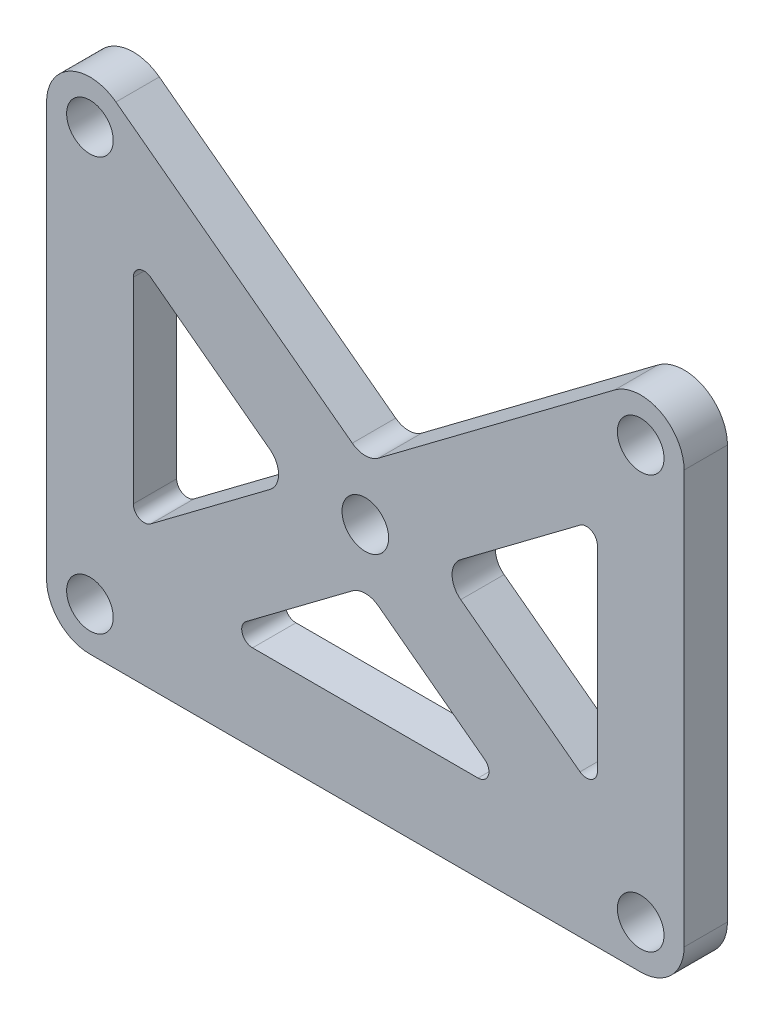
ISO-10303-21;
HEADER;
FILE_DESCRIPTION(('STEP AP214'),'2;1');
FILE_NAME('part.step','',(''),(''),'','','');
FILE_SCHEMA(('AUTOMOTIVE_DESIGN { 1 0 10303 214 1 1 1 1 }'));
ENDSEC;
DATA;
#1=APPLICATION_CONTEXT('core data for automotive mechanical design processes');
#2=APPLICATION_PROTOCOL_DEFINITION('international standard','automotive_design',2000,#1);
#3=PRODUCT_CONTEXT('',#1,'mechanical');
#4=PRODUCT('Part','Part','',(#3));
#5=PRODUCT_RELATED_PRODUCT_CATEGORY('part','',(#4));
#6=PRODUCT_DEFINITION_FORMATION('','',#4);
#7=PRODUCT_DEFINITION_CONTEXT('part definition',#1,'design');
#8=PRODUCT_DEFINITION('design','',#6,#7);
#9=PRODUCT_DEFINITION_SHAPE('','',#8);
#10=(LENGTH_UNIT() NAMED_UNIT(*) SI_UNIT(.MILLI.,.METRE.));
#11=(NAMED_UNIT(*) PLANE_ANGLE_UNIT() SI_UNIT($,.RADIAN.));
#12=(NAMED_UNIT(*) SI_UNIT($,.STERADIAN.) SOLID_ANGLE_UNIT());
#13=UNCERTAINTY_MEASURE_WITH_UNIT(LENGTH_MEASURE(1.E-05),#10,'distance_accuracy_value','');
#14=(GEOMETRIC_REPRESENTATION_CONTEXT(3) GLOBAL_UNCERTAINTY_ASSIGNED_CONTEXT((#13)) GLOBAL_UNIT_ASSIGNED_CONTEXT((#10,
#11,#12)) REPRESENTATION_CONTEXT('',''));
#15=CARTESIAN_POINT('',(0.,0.,0.));
#16=DIRECTION('',(0.,0.,1.));
#17=DIRECTION('',(1.,0.,0.));
#18=AXIS2_PLACEMENT_3D('',#15,#16,#17);
#19=CARTESIAN_POINT('',(-2.4,3.2,4.));
#20=DIRECTION('',(-0.6,0.8,0.));
#21=DIRECTION('',(-0.8,-0.6,0.));
#22=AXIS2_PLACEMENT_3D('',#19,#20,#21);
#23=PLANE('',#22);
#24=DIRECTION('',(0.8,0.6,0.));
#25=VECTOR('',#24,1.);
#26=CARTESIAN_POINT('',(-2.4,3.2,0.));
#27=LINE('',#26,#25);
#28=CARTESIAN_POINT('',(5.6,9.2,0.));
#29=VERTEX_POINT('',#28);
#30=CARTESIAN_POINT('',(16.6,17.45,0.));
#31=VERTEX_POINT('',#30);
#32=EDGE_CURVE('E355',#29,#31,#27,.T.);
#33=ORIENTED_EDGE('',*,*,#32,.F.);
#34=DIRECTION('',(0.,0.,-1.));
#35=VECTOR('',#34,1.);
#36=CARTESIAN_POINT('',(5.6,9.2,4.));
#37=LINE('',#36,#35);
#38=CARTESIAN_POINT('',(5.6,9.2,4.));
#39=VERTEX_POINT('',#38);
#40=EDGE_CURVE('E320',#29,#39,#37,.F.);
#41=ORIENTED_EDGE('',*,*,#40,.T.);
#42=DIRECTION('',(0.8,0.6,0.));
#43=VECTOR('',#42,1.);
#44=CARTESIAN_POINT('',(-2.4,3.2,4.));
#45=LINE('',#44,#43);
#46=CARTESIAN_POINT('',(16.6,17.45,4.));
#47=VERTEX_POINT('',#46);
#48=EDGE_CURVE('E368',#39,#47,#45,.T.);
#49=ORIENTED_EDGE('',*,*,#48,.T.);
#50=DIRECTION('',(0.,0.,-1.));
#51=VECTOR('',#50,1.);
#52=CARTESIAN_POINT('',(16.6,17.45,4.));
#53=LINE('',#52,#51);
#54=EDGE_CURVE('E265',#47,#31,#53,.T.);
#55=ORIENTED_EDGE('',*,*,#54,.T.);
#56=EDGE_LOOP('',(#33,#41,#49,#55));
#57=FACE_BOUND('',#56,.T.);
#58=ADVANCED_FACE('F39',(#57),#23,.T.);
#59=CARTESIAN_POINT('',(4.,0.,4.));
#60=DIRECTION('',(1.,0.,0.));
#61=DIRECTION('',(0.,1.,0.));
#62=AXIS2_PLACEMENT_3D('',#59,#60,#61);
#63=PLANE('',#62);
#64=DIRECTION('',(0.,-1.,0.));
#65=VECTOR('',#64,1.);
#66=CARTESIAN_POINT('',(4.,0.,4.));
#67=LINE('',#66,#65);
#68=CARTESIAN_POINT('',(4.,28.1,4.));
#69=VERTEX_POINT('',#68);
#70=CARTESIAN_POINT('',(4.,10.,4.));
#71=VERTEX_POINT('',#70);
#72=EDGE_CURVE('E363',#69,#71,#67,.T.);
#73=ORIENTED_EDGE('',*,*,#72,.T.);
#74=DIRECTION('',(0.,0.,-1.));
#75=VECTOR('',#74,1.);
#76=CARTESIAN_POINT('',(4.,10.,0.));
#77=LINE('',#76,#75);
#78=CARTESIAN_POINT('',(4.,10.,0.));
#79=VERTEX_POINT('',#78);
#80=EDGE_CURVE('E317',#71,#79,#77,.T.);
#81=ORIENTED_EDGE('',*,*,#80,.T.);
#82=DIRECTION('',(0.,-1.,0.));
#83=VECTOR('',#82,1.);
#84=CARTESIAN_POINT('',(4.,0.,0.));
#85=LINE('',#84,#83);
#86=CARTESIAN_POINT('',(4.,28.1,0.));
#87=VERTEX_POINT('',#86);
#88=EDGE_CURVE('E349',#87,#79,#85,.T.);
#89=ORIENTED_EDGE('',*,*,#88,.F.);
#90=DIRECTION('',(0.,0.,-1.));
#91=VECTOR('',#90,1.);
#92=CARTESIAN_POINT('',(4.,28.1,4.));
#93=LINE('',#92,#91);
#94=EDGE_CURVE('E315',#87,#69,#93,.F.);
#95=ORIENTED_EDGE('',*,*,#94,.T.);
#96=EDGE_LOOP('',(#73,#81,#89,#95));
#97=FACE_BOUND('',#96,.T.);
#98=ADVANCED_FACE('F353',(#97),#63,.T.);
#99=CARTESIAN_POINT('',(15.888,21.184,4.));
#100=DIRECTION('',(0.6,0.8,0.));
#101=DIRECTION('',(-0.8,0.6,0.));
#102=AXIS2_PLACEMENT_3D('',#99,#100,#101);
#103=PLANE('',#102);
#104=DIRECTION('',(0.8,-0.6,0.));
#105=VECTOR('',#104,1.);
#106=CARTESIAN_POINT('',(15.888,21.184,0.));
#107=LINE('',#106,#105);
#108=CARTESIAN_POINT('',(26.6,13.15,0.));
#109=VERTEX_POINT('',#108);
#110=CARTESIAN_POINT('',(36.4,5.8,0.));
#111=VERTEX_POINT('',#110);
#112=EDGE_CURVE('E416',#109,#111,#107,.T.);
#113=ORIENTED_EDGE('',*,*,#112,.T.);
#114=DIRECTION('',(0.,0.,-1.));
#115=VECTOR('',#114,1.);
#116=CARTESIAN_POINT('',(36.4,5.8,4.));
#117=LINE('',#116,#115);
#118=CARTESIAN_POINT('',(36.4,5.8,4.));
#119=VERTEX_POINT('',#118);
#120=EDGE_CURVE('E310',#111,#119,#117,.F.);
#121=ORIENTED_EDGE('',*,*,#120,.T.);
#122=DIRECTION('',(0.8,-0.6,0.));
#123=VECTOR('',#122,1.);
#124=CARTESIAN_POINT('',(15.888,21.184,4.));
#125=LINE('',#124,#123);
#126=CARTESIAN_POINT('',(26.6,13.15,4.));
#127=VERTEX_POINT('',#126);
#128=EDGE_CURVE('E508',#127,#119,#125,.T.);
#129=ORIENTED_EDGE('',*,*,#128,.F.);
#130=DIRECTION('',(0.,0.,-1.));
#131=VECTOR('',#130,1.);
#132=CARTESIAN_POINT('',(26.6,13.15,0.));
#133=LINE('',#132,#131);
#134=EDGE_CURVE('E249',#127,#109,#133,.T.);
#135=ORIENTED_EDGE('',*,*,#134,.T.);
#136=EDGE_LOOP('',(#113,#121,#129,#135));
#137=FACE_BOUND('',#136,.T.);
#138=ADVANCED_FACE('F541',(#137),#103,.F.);
#139=CARTESIAN_POINT('',(0.,4.,4.));
#140=DIRECTION('',(0.,1.,0.));
#141=DIRECTION('',(-1.,0.,0.));
#142=AXIS2_PLACEMENT_3D('',#139,#140,#141);
#143=PLANE('',#142);
#144=DIRECTION('',(1.,0.,0.));
#145=VECTOR('',#144,1.);
#146=CARTESIAN_POINT('',(0.,4.,4.));
#147=LINE('',#146,#145);
#148=CARTESIAN_POINT('',(15.,4.,4.));
#149=VERTEX_POINT('',#148);
#150=CARTESIAN_POINT('',(35.8,4.,4.));
#151=VERTEX_POINT('',#150);
#152=EDGE_CURVE('E511',#149,#151,#147,.T.);
#153=ORIENTED_EDGE('',*,*,#152,.T.);
#154=DIRECTION('',(0.,0.,-1.));
#155=VECTOR('',#154,1.);
#156=CARTESIAN_POINT('',(35.8,4.,4.));
#157=LINE('',#156,#155);
#158=CARTESIAN_POINT('',(35.8,4.,0.));
#159=VERTEX_POINT('',#158);
#160=EDGE_CURVE('E307',#151,#159,#157,.T.);
#161=ORIENTED_EDGE('',*,*,#160,.T.);
#162=DIRECTION('',(1.,0.,0.));
#163=VECTOR('',#162,1.);
#164=CARTESIAN_POINT('',(0.,4.,0.));
#165=LINE('',#164,#163);
#166=CARTESIAN_POINT('',(15.,4.,0.));
#167=VERTEX_POINT('',#166);
#168=EDGE_CURVE('E419',#167,#159,#165,.T.);
#169=ORIENTED_EDGE('',*,*,#168,.F.);
#170=DIRECTION('',(0.,0.,-1.));
#171=VECTOR('',#170,1.);
#172=CARTESIAN_POINT('',(15.,4.,4.));
#173=LINE('',#172,#171);
#174=EDGE_CURVE('E305',#167,#149,#173,.F.);
#175=ORIENTED_EDGE('',*,*,#174,.T.);
#176=EDGE_LOOP('',(#153,#161,#169,#175));
#177=FACE_BOUND('',#176,.T.);
#178=ADVANCED_FACE('F550',(#177),#143,.T.);
#179=CARTESIAN_POINT('',(46.8,0.,4.));
#180=DIRECTION('',(1.,0.,0.));
#181=DIRECTION('',(0.,0.,-1.));
#182=AXIS2_PLACEMENT_3D('',#179,#180,#181);
#183=PLANE('',#182);
#184=DIRECTION('',(0.,-1.,0.));
#185=VECTOR('',#184,1.);
#186=CARTESIAN_POINT('',(46.8,0.,0.));
#187=LINE('',#186,#185);
#188=CARTESIAN_POINT('',(46.8,28.1,0.));
#189=VERTEX_POINT('',#188);
#190=CARTESIAN_POINT('',(46.8,9.99999999999999,0.));
#191=VERTEX_POINT('',#190);
#192=EDGE_CURVE('E407',#189,#191,#187,.T.);
#193=ORIENTED_EDGE('',*,*,#192,.T.);
#194=DIRECTION('',(0.,0.,-1.));
#195=VECTOR('',#194,1.);
#196=CARTESIAN_POINT('',(46.8,9.99999999999999,4.));
#197=LINE('',#196,#195);
#198=CARTESIAN_POINT('',(46.8,9.99999999999999,4.));
#199=VERTEX_POINT('',#198);
#200=EDGE_CURVE('E301',#191,#199,#197,.F.);
#201=ORIENTED_EDGE('',*,*,#200,.T.);
#202=DIRECTION('',(0.,-1.,0.));
#203=VECTOR('',#202,1.);
#204=CARTESIAN_POINT('',(46.8,0.,4.));
#205=LINE('',#204,#203);
#206=CARTESIAN_POINT('',(46.8,28.1,4.));
#207=VERTEX_POINT('',#206);
#208=EDGE_CURVE('E499',#207,#199,#205,.T.);
#209=ORIENTED_EDGE('',*,*,#208,.F.);
#210=DIRECTION('',(0.,0.,-1.));
#211=VECTOR('',#210,1.);
#212=CARTESIAN_POINT('',(46.8,28.1,0.));
#213=LINE('',#212,#211);
#214=EDGE_CURVE('E298',#207,#189,#213,.T.);
#215=ORIENTED_EDGE('',*,*,#214,.T.);
#216=EDGE_LOOP('',(#193,#201,#209,#215));
#217=FACE_BOUND('',#216,.T.);
#218=ADVANCED_FACE('F553',(#217),#183,.F.);
#219=CARTESIAN_POINT('',(20.688,27.584,4.));
#220=DIRECTION('',(0.6,0.8,0.));
#221=DIRECTION('',(-0.8,0.6,0.));
#222=AXIS2_PLACEMENT_3D('',#219,#220,#221);
#223=PLANE('',#222);
#224=DIRECTION('',(0.8,-0.6,0.));
#225=VECTOR('',#224,1.);
#226=CARTESIAN_POINT('',(20.688,27.584,4.));
#227=LINE('',#226,#225);
#228=CARTESIAN_POINT('',(34.2,17.45,4.));
#229=VERTEX_POINT('',#228);
#230=CARTESIAN_POINT('',(45.2,9.2,4.));
#231=VERTEX_POINT('',#230);
#232=EDGE_CURVE('E502',#229,#231,#227,.T.);
#233=ORIENTED_EDGE('',*,*,#232,.T.);
#234=DIRECTION('',(0.,0.,-1.));
#235=VECTOR('',#234,1.);
#236=CARTESIAN_POINT('',(45.2,9.19999999999999,4.));
#237=LINE('',#236,#235);
#238=CARTESIAN_POINT('',(45.2,9.2,0.));
#239=VERTEX_POINT('',#238);
#240=EDGE_CURVE('E295',#231,#239,#237,.T.);
#241=ORIENTED_EDGE('',*,*,#240,.T.);
#242=DIRECTION('',(0.8,-0.6,0.));
#243=VECTOR('',#242,1.);
#244=CARTESIAN_POINT('',(20.688,27.584,0.));
#245=LINE('',#244,#243);
#246=CARTESIAN_POINT('',(34.2,17.45,0.));
#247=VERTEX_POINT('',#246);
#248=EDGE_CURVE('E410',#247,#239,#245,.T.);
#249=ORIENTED_EDGE('',*,*,#248,.F.);
#250=DIRECTION('',(0.,0.,-1.));
#251=VECTOR('',#250,1.);
#252=CARTESIAN_POINT('',(34.2,17.45,4.));
#253=LINE('',#252,#251);
#254=EDGE_CURVE('E263',#247,#229,#253,.F.);
#255=ORIENTED_EDGE('',*,*,#254,.T.);
#256=EDGE_LOOP('',(#233,#241,#249,#255));
#257=FACE_BOUND('',#256,.T.);
#258=ADVANCED_FACE('F561',(#257),#223,.T.);
#259=CARTESIAN_POINT('',(0.,-4.,4.));
#260=DIRECTION('',(0.,1.,0.));
#261=DIRECTION('',(-1.,0.,0.));
#262=AXIS2_PLACEMENT_3D('',#259,#260,#261);
#263=PLANE('',#262);
#264=DIRECTION('',(1.,0.,0.));
#265=VECTOR('',#264,1.);
#266=CARTESIAN_POINT('',(0.,-4.,0.));
#267=LINE('',#266,#265);
#268=CARTESIAN_POINT('',(0.,-4.,0.));
#269=VERTEX_POINT('',#268);
#270=CARTESIAN_POINT('',(50.8,-4.,0.));
#271=VERTEX_POINT('',#270);
#272=EDGE_CURVE('E248',#269,#271,#267,.T.);
#273=ORIENTED_EDGE('',*,*,#272,.T.);
#274=DIRECTION('',(0.,0.,-1.));
#275=VECTOR('',#274,1.);
#276=CARTESIAN_POINT('',(50.8,-4.,4.));
#277=LINE('',#276,#275);
#278=CARTESIAN_POINT('',(50.8,-4.,4.));
#279=VERTEX_POINT('',#278);
#280=EDGE_CURVE('E228',#279,#271,#277,.T.);
#281=ORIENTED_EDGE('',*,*,#280,.F.);
#282=DIRECTION('',(1.,0.,0.));
#283=VECTOR('',#282,1.);
#284=CARTESIAN_POINT('',(0.,-4.,4.));
#285=LINE('',#284,#283);
#286=CARTESIAN_POINT('',(0.,-4.,4.));
#287=VERTEX_POINT('',#286);
#288=EDGE_CURVE('E235',#287,#279,#285,.T.);
#289=ORIENTED_EDGE('',*,*,#288,.F.);
#290=DIRECTION('',(0.,0.,-1.));
#291=VECTOR('',#290,1.);
#292=CARTESIAN_POINT('',(0.,-4.,4.));
#293=LINE('',#292,#291);
#294=EDGE_CURVE('E383',#287,#269,#293,.T.);
#295=ORIENTED_EDGE('',*,*,#294,.T.);
#296=EDGE_LOOP('',(#273,#281,#289,#295));
#297=FACE_BOUND('',#296,.T.);
#298=ADVANCED_FACE('F246',(#297),#263,.F.);
#299=CARTESIAN_POINT('',(50.8,0.,4.));
#300=DIRECTION('',(0.,0.,-1.));
#301=DIRECTION('',(-1.,0.,0.));
#302=AXIS2_PLACEMENT_3D('',#299,#300,#301);
#303=CYLINDRICAL_SURFACE('',#302,4.);
#304=CARTESIAN_POINT('',(50.8,0.,0.));
#305=DIRECTION('',(0.,0.,1.));
#306=DIRECTION('',(1.,0.,0.));
#307=AXIS2_PLACEMENT_3D('',#304,#305,#306);
#308=CIRCLE('',#307,4.);
#309=CARTESIAN_POINT('',(54.8,0.,0.));
#310=VERTEX_POINT('',#309);
#311=EDGE_CURVE('E385',#271,#310,#308,.T.);
#312=ORIENTED_EDGE('',*,*,#311,.T.);
#313=DIRECTION('',(0.,0.,-1.));
#314=VECTOR('',#313,1.);
#315=CARTESIAN_POINT('',(54.8,0.,4.));
#316=LINE('',#315,#314);
#317=CARTESIAN_POINT('',(54.8,0.,4.));
#318=VERTEX_POINT('',#317);
#319=EDGE_CURVE('E230',#318,#310,#316,.T.);
#320=ORIENTED_EDGE('',*,*,#319,.F.);
#321=CARTESIAN_POINT('',(50.8,0.,4.));
#322=DIRECTION('',(0.,0.,1.));
#323=DIRECTION('',(1.,0.,0.));
#324=AXIS2_PLACEMENT_3D('',#321,#322,#323);
#325=CIRCLE('',#324,4.);
#326=EDGE_CURVE('E223',#279,#318,#325,.T.);
#327=ORIENTED_EDGE('',*,*,#326,.F.);
#328=ORIENTED_EDGE('',*,*,#280,.T.);
#329=EDGE_LOOP('',(#312,#320,#327,#328));
#330=FACE_BOUND('',#329,.T.);
#331=ADVANCED_FACE('F226',(#330),#303,.T.);
#332=CARTESIAN_POINT('',(54.8,0.,4.));
#333=DIRECTION('',(1.,0.,0.));
#334=DIRECTION('',(0.,0.,-1.));
#335=AXIS2_PLACEMENT_3D('',#332,#333,#334);
#336=PLANE('',#335);
#337=DIRECTION('',(0.,-1.,0.));
#338=VECTOR('',#337,1.);
#339=CARTESIAN_POINT('',(54.8,0.,0.));
#340=LINE('',#339,#338);
#341=CARTESIAN_POINT('',(54.8,38.1,0.));
#342=VERTEX_POINT('',#341);
#343=EDGE_CURVE('E387',#342,#310,#340,.T.);
#344=ORIENTED_EDGE('',*,*,#343,.F.);
#345=DIRECTION('',(0.,0.,-1.));
#346=VECTOR('',#345,1.);
#347=CARTESIAN_POINT('',(54.8,38.1,4.));
#348=LINE('',#347,#346);
#349=CARTESIAN_POINT('',(54.8,38.1,4.));
#350=VERTEX_POINT('',#349);
#351=EDGE_CURVE('E254',#350,#342,#348,.T.);
#352=ORIENTED_EDGE('',*,*,#351,.F.);
#353=DIRECTION('',(0.,-1.,0.));
#354=VECTOR('',#353,1.);
#355=CARTESIAN_POINT('',(54.8,0.,4.));
#356=LINE('',#355,#354);
#357=EDGE_CURVE('E234',#350,#318,#356,.T.);
#358=ORIENTED_EDGE('',*,*,#357,.T.);
#359=ORIENTED_EDGE('',*,*,#319,.T.);
#360=EDGE_LOOP('',(#344,#352,#358,#359));
#361=FACE_BOUND('',#360,.T.);
#362=ADVANCED_FACE('F461',(#361),#336,.T.);
#363=CARTESIAN_POINT('',(50.8,38.1,4.));
#364=DIRECTION('',(0.,0.,-1.));
#365=DIRECTION('',(-1.,0.,0.));
#366=AXIS2_PLACEMENT_3D('',#363,#364,#365);
#367=CYLINDRICAL_SURFACE('',#366,4.);
#368=CARTESIAN_POINT('',(50.8,38.1,0.));
#369=DIRECTION('',(0.,0.,1.));
#370=DIRECTION('',(1.,0.,0.));
#371=AXIS2_PLACEMENT_3D('',#368,#369,#370);
#372=CIRCLE('',#371,4.);
#373=CARTESIAN_POINT('',(48.4,41.3,0.));
#374=VERTEX_POINT('',#373);
#375=EDGE_CURVE('E390',#342,#374,#372,.T.);
#376=ORIENTED_EDGE('',*,*,#375,.T.);
#377=DIRECTION('',(0.,0.,-1.));
#378=VECTOR('',#377,1.);
#379=CARTESIAN_POINT('',(48.4,41.3,4.));
#380=LINE('',#379,#378);
#381=CARTESIAN_POINT('',(48.4,41.3,4.));
#382=VERTEX_POINT('',#381);
#383=EDGE_CURVE('E447',#382,#374,#380,.T.);
#384=ORIENTED_EDGE('',*,*,#383,.F.);
#385=CARTESIAN_POINT('',(50.8,38.1,4.));
#386=DIRECTION('',(0.,0.,1.));
#387=DIRECTION('',(1.,0.,0.));
#388=AXIS2_PLACEMENT_3D('',#385,#386,#387);
#389=CIRCLE('',#388,4.);
#390=EDGE_CURVE('E455',#350,#382,#389,.T.);
#391=ORIENTED_EDGE('',*,*,#390,.F.);
#392=ORIENTED_EDGE('',*,*,#351,.T.);
#393=EDGE_LOOP('',(#376,#384,#391,#392));
#394=FACE_BOUND('',#393,.T.);
#395=ADVANCED_FACE('F452',(#394),#367,.T.);
#396=CARTESIAN_POINT('',(-2.4,3.2,4.));
#397=DIRECTION('',(-0.6,0.8,0.));
#398=DIRECTION('',(-0.8,-0.6,0.));
#399=AXIS2_PLACEMENT_3D('',#396,#397,#398);
#400=PLANE('',#399);
#401=DIRECTION('',(0.8,0.6,0.));
#402=VECTOR('',#401,1.);
#403=CARTESIAN_POINT('',(-2.4,3.2,0.));
#404=LINE('',#403,#402);
#405=CARTESIAN_POINT('',(26.6,24.95,0.));
#406=VERTEX_POINT('',#405);
#407=EDGE_CURVE('E393',#406,#374,#404,.T.);
#408=ORIENTED_EDGE('',*,*,#407,.F.);
#409=DIRECTION('',(0.,0.,-1.));
#410=VECTOR('',#409,1.);
#411=CARTESIAN_POINT('',(26.6,24.95,4.));
#412=LINE('',#411,#410);
#413=CARTESIAN_POINT('',(26.6,24.95,4.));
#414=VERTEX_POINT('',#413);
#415=EDGE_CURVE('E274',#406,#414,#412,.F.);
#416=ORIENTED_EDGE('',*,*,#415,.T.);
#417=DIRECTION('',(0.8,0.6,0.));
#418=VECTOR('',#417,1.);
#419=CARTESIAN_POINT('',(-2.4,3.2,4.));
#420=LINE('',#419,#418);
#421=EDGE_CURVE('E490',#414,#382,#420,.T.);
#422=ORIENTED_EDGE('',*,*,#421,.T.);
#423=ORIENTED_EDGE('',*,*,#383,.T.);
#424=EDGE_LOOP('',(#408,#416,#422,#423));
#425=FACE_BOUND('',#424,.T.);
#426=ADVANCED_FACE('F485',(#425),#400,.T.);
#427=CARTESIAN_POINT('',(20.688,27.584,4.));
#428=DIRECTION('',(0.6,0.8,0.));
#429=DIRECTION('',(-0.8,0.6,0.));
#430=AXIS2_PLACEMENT_3D('',#427,#428,#429);
#431=PLANE('',#430);
#432=DIRECTION('',(0.8,-0.6,0.));
#433=VECTOR('',#432,1.);
#434=CARTESIAN_POINT('',(20.688,27.584,4.));
#435=LINE('',#434,#433);
#436=CARTESIAN_POINT('',(2.4,41.3,4.));
#437=VERTEX_POINT('',#436);
#438=CARTESIAN_POINT('',(24.2,24.95,4.));
#439=VERTEX_POINT('',#438);
#440=EDGE_CURVE('E489',#437,#439,#435,.T.);
#441=ORIENTED_EDGE('',*,*,#440,.T.);
#442=DIRECTION('',(0.,0.,-1.));
#443=VECTOR('',#442,1.);
#444=CARTESIAN_POINT('',(24.2,24.95,0.));
#445=LINE('',#444,#443);
#446=CARTESIAN_POINT('',(24.2,24.95,0.));
#447=VERTEX_POINT('',#446);
#448=EDGE_CURVE('E271',#439,#447,#445,.T.);
#449=ORIENTED_EDGE('',*,*,#448,.T.);
#450=DIRECTION('',(0.8,-0.6,0.));
#451=VECTOR('',#450,1.);
#452=CARTESIAN_POINT('',(20.688,27.584,0.));
#453=LINE('',#452,#451);
#454=CARTESIAN_POINT('',(2.4,41.3,0.));
#455=VERTEX_POINT('',#454);
#456=EDGE_CURVE('E395',#455,#447,#453,.T.);
#457=ORIENTED_EDGE('',*,*,#456,.F.);
#458=DIRECTION('',(0.,0.,-1.));
#459=VECTOR('',#458,1.);
#460=CARTESIAN_POINT('',(2.4,41.3,4.));
#461=LINE('',#460,#459);
#462=EDGE_CURVE('E445',#437,#455,#461,.T.);
#463=ORIENTED_EDGE('',*,*,#462,.F.);
#464=EDGE_LOOP('',(#441,#449,#457,#463));
#465=FACE_BOUND('',#464,.T.);
#466=ADVANCED_FACE('F480',(#465),#431,.T.);
#467=CARTESIAN_POINT('',(0.,38.1,4.));
#468=DIRECTION('',(0.,0.,-1.));
#469=DIRECTION('',(-1.,0.,0.));
#470=AXIS2_PLACEMENT_3D('',#467,#468,#469);
#471=CYLINDRICAL_SURFACE('',#470,4.);
#472=CARTESIAN_POINT('',(0.,38.1,0.));
#473=DIRECTION('',(0.,0.,1.));
#474=DIRECTION('',(1.,0.,0.));
#475=AXIS2_PLACEMENT_3D('',#472,#473,#474);
#476=CIRCLE('',#475,4.);
#477=CARTESIAN_POINT('',(-4.,38.1,0.));
#478=VERTEX_POINT('',#477);
#479=EDGE_CURVE('E398',#478,#455,#476,.F.);
#480=ORIENTED_EDGE('',*,*,#479,.F.);
#481=DIRECTION('',(0.,0.,-1.));
#482=VECTOR('',#481,1.);
#483=CARTESIAN_POINT('',(-4.,38.1,4.));
#484=LINE('',#483,#482);
#485=CARTESIAN_POINT('',(-4.,38.1,4.));
#486=VERTEX_POINT('',#485);
#487=EDGE_CURVE('E443',#486,#478,#484,.T.);
#488=ORIENTED_EDGE('',*,*,#487,.F.);
#489=CARTESIAN_POINT('',(0.,38.1,4.));
#490=DIRECTION('',(0.,0.,1.));
#491=DIRECTION('',(1.,0.,0.));
#492=AXIS2_PLACEMENT_3D('',#489,#490,#491);
#493=CIRCLE('',#492,4.);
#494=EDGE_CURVE('E476',#486,#437,#493,.F.);
#495=ORIENTED_EDGE('',*,*,#494,.T.);
#496=ORIENTED_EDGE('',*,*,#462,.T.);
#497=EDGE_LOOP('',(#480,#488,#495,#496));
#498=FACE_BOUND('',#497,.T.);
#499=ADVANCED_FACE('F472',(#498),#471,.T.);
#500=CARTESIAN_POINT('',(-4.,0.,4.));
#501=DIRECTION('',(1.,0.,0.));
#502=DIRECTION('',(0.,1.,0.));
#503=AXIS2_PLACEMENT_3D('',#500,#501,#502);
#504=PLANE('',#503);
#505=DIRECTION('',(0.,-1.,0.));
#506=VECTOR('',#505,1.);
#507=CARTESIAN_POINT('',(-4.,0.,0.));
#508=LINE('',#507,#506);
#509=CARTESIAN_POINT('',(-4.,0.,0.));
#510=VERTEX_POINT('',#509);
#511=EDGE_CURVE('E401',#478,#510,#508,.T.);
#512=ORIENTED_EDGE('',*,*,#511,.T.);
#513=DIRECTION('',(0.,0.,-1.));
#514=VECTOR('',#513,1.);
#515=CARTESIAN_POINT('',(-4.,0.,4.));
#516=LINE('',#515,#514);
#517=CARTESIAN_POINT('',(-4.,0.,4.));
#518=VERTEX_POINT('',#517);
#519=EDGE_CURVE('E441',#518,#510,#516,.T.);
#520=ORIENTED_EDGE('',*,*,#519,.F.);
#521=DIRECTION('',(0.,-1.,0.));
#522=VECTOR('',#521,1.);
#523=CARTESIAN_POINT('',(-4.,0.,4.));
#524=LINE('',#523,#522);
#525=EDGE_CURVE('E492',#486,#518,#524,.T.);
#526=ORIENTED_EDGE('',*,*,#525,.F.);
#527=ORIENTED_EDGE('',*,*,#487,.T.);
#528=EDGE_LOOP('',(#512,#520,#526,#527));
#529=FACE_BOUND('',#528,.T.);
#530=ADVANCED_FACE('F469',(#529),#504,.F.);
#531=CARTESIAN_POINT('',(0.,0.,4.));
#532=DIRECTION('',(0.,0.,-1.));
#533=DIRECTION('',(-1.,0.,0.));
#534=AXIS2_PLACEMENT_3D('',#531,#532,#533);
#535=CYLINDRICAL_SURFACE('',#534,2.15);
#536=CARTESIAN_POINT('',(0.,0.,4.));
#537=DIRECTION('',(0.,0.,1.));
#538=DIRECTION('',(1.,0.,0.));
#539=AXIS2_PLACEMENT_3D('',#536,#537,#538);
#540=CIRCLE('',#539,2.15);
#541=CARTESIAN_POINT('',(2.15,0.,4.));
#542=VERTEX_POINT('',#541);
#543=EDGE_CURVE('E377',#542,#542,#540,.T.);
#544=ORIENTED_EDGE('',*,*,#543,.T.);
#545=EDGE_LOOP('',(#544));
#546=FACE_BOUND('',#545,.T.);
#547=CARTESIAN_POINT('',(0.,0.,0.));
#548=DIRECTION('',(0.,0.,1.));
#549=DIRECTION('',(1.,0.,0.));
#550=AXIS2_PLACEMENT_3D('',#547,#548,#549);
#551=CIRCLE('',#550,2.15);
#552=CARTESIAN_POINT('',(2.15,0.,0.));
#553=VERTEX_POINT('',#552);
#554=EDGE_CURVE('E435',#553,#553,#551,.T.);
#555=ORIENTED_EDGE('',*,*,#554,.F.);
#556=EDGE_LOOP('',(#555));
#557=FACE_BOUND('',#556,.T.);
#558=ADVANCED_FACE('F573',(#546,#557),#535,.F.);
#559=CARTESIAN_POINT('',(50.8,38.1,4.));
#560=DIRECTION('',(0.,0.,-1.));
#561=DIRECTION('',(-1.,0.,0.));
#562=AXIS2_PLACEMENT_3D('',#559,#560,#561);
#563=CYLINDRICAL_SURFACE('',#562,2.15);
#564=CARTESIAN_POINT('',(50.8,38.1,4.));
#565=DIRECTION('',(0.,0.,1.));
#566=DIRECTION('',(1.,0.,0.));
#567=AXIS2_PLACEMENT_3D('',#564,#565,#566);
#568=CIRCLE('',#567,2.15);
#569=CARTESIAN_POINT('',(52.95,38.1,4.));
#570=VERTEX_POINT('',#569);
#571=EDGE_CURVE('E374',#570,#570,#568,.T.);
#572=ORIENTED_EDGE('',*,*,#571,.T.);
#573=EDGE_LOOP('',(#572));
#574=FACE_BOUND('',#573,.T.);
#575=CARTESIAN_POINT('',(50.8,38.1,0.));
#576=DIRECTION('',(0.,0.,1.));
#577=DIRECTION('',(1.,0.,0.));
#578=AXIS2_PLACEMENT_3D('',#575,#576,#577);
#579=CIRCLE('',#578,2.15);
#580=CARTESIAN_POINT('',(52.95,38.1,0.));
#581=VERTEX_POINT('',#580);
#582=EDGE_CURVE('E432',#581,#581,#579,.T.);
#583=ORIENTED_EDGE('',*,*,#582,.F.);
#584=EDGE_LOOP('',(#583));
#585=FACE_BOUND('',#584,.T.);
#586=ADVANCED_FACE('F641',(#574,#585),#563,.F.);
#587=CARTESIAN_POINT('',(25.4,19.05,4.));
#588=DIRECTION('',(0.,0.,-1.));
#589=DIRECTION('',(-1.,0.,0.));
#590=AXIS2_PLACEMENT_3D('',#587,#588,#589);
#591=CYLINDRICAL_SURFACE('',#590,2.15);
#592=CARTESIAN_POINT('',(25.4,19.05,4.));
#593=DIRECTION('',(0.,0.,1.));
#594=DIRECTION('',(1.,0.,0.));
#595=AXIS2_PLACEMENT_3D('',#592,#593,#594);
#596=CIRCLE('',#595,2.15);
#597=CARTESIAN_POINT('',(27.55,19.05,4.));
#598=VERTEX_POINT('',#597);
#599=EDGE_CURVE('E366',#598,#598,#596,.T.);
#600=ORIENTED_EDGE('',*,*,#599,.T.);
#601=EDGE_LOOP('',(#600));
#602=FACE_BOUND('',#601,.T.);
#603=CARTESIAN_POINT('',(25.4,19.05,0.));
#604=DIRECTION('',(0.,0.,1.));
#605=DIRECTION('',(1.,0.,0.));
#606=AXIS2_PLACEMENT_3D('',#603,#604,#605);
#607=CIRCLE('',#606,2.15);
#608=CARTESIAN_POINT('',(27.55,19.05,0.));
#609=VERTEX_POINT('',#608);
#610=EDGE_CURVE('E429',#609,#609,#607,.T.);
#611=ORIENTED_EDGE('',*,*,#610,.F.);
#612=EDGE_LOOP('',(#611));
#613=FACE_BOUND('',#612,.T.);
#614=ADVANCED_FACE('F645',(#602,#613),#591,.F.);
#615=CARTESIAN_POINT('',(0.,38.1,4.));
#616=DIRECTION('',(0.,0.,-1.));
#617=DIRECTION('',(-1.,0.,0.));
#618=AXIS2_PLACEMENT_3D('',#615,#616,#617);
#619=CYLINDRICAL_SURFACE('',#618,2.15);
#620=CARTESIAN_POINT('',(0.,38.1,4.));
#621=DIRECTION('',(0.,0.,1.));
#622=DIRECTION('',(1.,0.,0.));
#623=AXIS2_PLACEMENT_3D('',#620,#621,#622);
#624=CIRCLE('',#623,2.15);
#625=CARTESIAN_POINT('',(2.15,38.1,4.));
#626=VERTEX_POINT('',#625);
#627=EDGE_CURVE('E362',#626,#626,#624,.T.);
#628=ORIENTED_EDGE('',*,*,#627,.T.);
#629=EDGE_LOOP('',(#628));
#630=FACE_BOUND('',#629,.T.);
#631=CARTESIAN_POINT('',(0.,38.1,0.));
#632=DIRECTION('',(0.,0.,1.));
#633=DIRECTION('',(1.,0.,0.));
#634=AXIS2_PLACEMENT_3D('',#631,#632,#633);
#635=CIRCLE('',#634,2.15);
#636=CARTESIAN_POINT('',(2.15,38.1,0.));
#637=VERTEX_POINT('',#636);
#638=EDGE_CURVE('E426',#637,#637,#635,.T.);
#639=ORIENTED_EDGE('',*,*,#638,.F.);
#640=EDGE_LOOP('',(#639));
#641=FACE_BOUND('',#640,.T.);
#642=ADVANCED_FACE('F649',(#630,#641),#619,.F.);
#643=CARTESIAN_POINT('',(15.888,21.184,4.));
#644=DIRECTION('',(0.6,0.8,0.));
#645=DIRECTION('',(-0.8,0.6,0.));
#646=AXIS2_PLACEMENT_3D('',#643,#644,#645);
#647=PLANE('',#646);
#648=DIRECTION('',(0.8,-0.6,0.));
#649=VECTOR('',#648,1.);
#650=CARTESIAN_POINT('',(15.888,21.184,4.));
#651=LINE('',#650,#649);
#652=CARTESIAN_POINT('',(5.6,28.9,4.));
#653=VERTEX_POINT('',#652);
#654=CARTESIAN_POINT('',(16.6,20.65,4.));
#655=VERTEX_POINT('',#654);
#656=EDGE_CURVE('E359',#653,#655,#651,.T.);
#657=ORIENTED_EDGE('',*,*,#656,.F.);
#658=DIRECTION('',(0.,0.,-1.));
#659=VECTOR('',#658,1.);
#660=CARTESIAN_POINT('',(5.6,28.9,4.));
#661=LINE('',#660,#659);
#662=CARTESIAN_POINT('',(5.6,28.9,0.));
#663=VERTEX_POINT('',#662);
#664=EDGE_CURVE('E322',#653,#663,#661,.T.);
#665=ORIENTED_EDGE('',*,*,#664,.T.);
#666=DIRECTION('',(0.8,-0.6,0.));
#667=VECTOR('',#666,1.);
#668=CARTESIAN_POINT('',(15.888,21.184,0.));
#669=LINE('',#668,#667);
#670=CARTESIAN_POINT('',(16.6,20.65,0.));
#671=VERTEX_POINT('',#670);
#672=EDGE_CURVE('E350',#663,#671,#669,.T.);
#673=ORIENTED_EDGE('',*,*,#672,.T.);
#674=DIRECTION('',(0.,0.,-1.));
#675=VECTOR('',#674,1.);
#676=CARTESIAN_POINT('',(16.6,20.65,4.));
#677=LINE('',#676,#675);
#678=EDGE_CURVE('E268',#671,#655,#677,.F.);
#679=ORIENTED_EDGE('',*,*,#678,.T.);
#680=EDGE_LOOP('',(#657,#665,#673,#679));
#681=FACE_BOUND('',#680,.T.);
#682=ADVANCED_FACE('F358',(#681),#647,.F.);
#683=CARTESIAN_POINT('',(2.4,-3.2,4.));
#684=DIRECTION('',(-0.6,0.8,0.));
#685=DIRECTION('',(-0.8,-0.6,0.));
#686=AXIS2_PLACEMENT_3D('',#683,#684,#685);
#687=PLANE('',#686);
#688=DIRECTION('',(0.8,0.6,0.));
#689=VECTOR('',#688,1.);
#690=CARTESIAN_POINT('',(2.4,-3.2,4.));
#691=LINE('',#690,#689);
#692=CARTESIAN_POINT('',(14.4,5.8,4.));
#693=VERTEX_POINT('',#692);
#694=CARTESIAN_POINT('',(24.2,13.15,4.));
#695=VERTEX_POINT('',#694);
#696=EDGE_CURVE('E514',#693,#695,#691,.T.);
#697=ORIENTED_EDGE('',*,*,#696,.F.);
#698=DIRECTION('',(0.,0.,-1.));
#699=VECTOR('',#698,1.);
#700=CARTESIAN_POINT('',(14.4,5.8,4.));
#701=LINE('',#700,#699);
#702=CARTESIAN_POINT('',(14.4,5.8,0.));
#703=VERTEX_POINT('',#702);
#704=EDGE_CURVE('E312',#693,#703,#701,.T.);
#705=ORIENTED_EDGE('',*,*,#704,.T.);
#706=DIRECTION('',(0.8,0.6,0.));
#707=VECTOR('',#706,1.);
#708=CARTESIAN_POINT('',(2.4,-3.2,0.));
#709=LINE('',#708,#707);
#710=CARTESIAN_POINT('',(24.2,13.15,0.));
#711=VERTEX_POINT('',#710);
#712=EDGE_CURVE('E422',#703,#711,#709,.T.);
#713=ORIENTED_EDGE('',*,*,#712,.T.);
#714=DIRECTION('',(0.,0.,-1.));
#715=VECTOR('',#714,1.);
#716=CARTESIAN_POINT('',(24.2,13.15,4.));
#717=LINE('',#716,#715);
#718=EDGE_CURVE('E252',#711,#695,#717,.F.);
#719=ORIENTED_EDGE('',*,*,#718,.T.);
#720=EDGE_LOOP('',(#697,#705,#713,#719));
#721=FACE_BOUND('',#720,.T.);
#722=ADVANCED_FACE('F545',(#721),#687,.F.);
#723=CARTESIAN_POINT('',(2.4,-3.2,4.));
#724=DIRECTION('',(-0.6,0.8,0.));
#725=DIRECTION('',(-0.8,-0.6,0.));
#726=AXIS2_PLACEMENT_3D('',#723,#724,#725);
#727=PLANE('',#726);
#728=DIRECTION('',(0.8,0.6,0.));
#729=VECTOR('',#728,1.);
#730=CARTESIAN_POINT('',(2.4,-3.2,0.));
#731=LINE('',#730,#729);
#732=CARTESIAN_POINT('',(34.2,20.65,0.));
#733=VERTEX_POINT('',#732);
#734=CARTESIAN_POINT('',(45.2,28.9,0.));
#735=VERTEX_POINT('',#734);
#736=EDGE_CURVE('E413',#733,#735,#731,.T.);
#737=ORIENTED_EDGE('',*,*,#736,.T.);
#738=DIRECTION('',(0.,0.,-1.));
#739=VECTOR('',#738,1.);
#740=CARTESIAN_POINT('',(45.2,28.9,4.));
#741=LINE('',#740,#739);
#742=CARTESIAN_POINT('',(45.2,28.9,4.));
#743=VERTEX_POINT('',#742);
#744=EDGE_CURVE('E303',#735,#743,#741,.F.);
#745=ORIENTED_EDGE('',*,*,#744,.T.);
#746=DIRECTION('',(0.8,0.6,0.));
#747=VECTOR('',#746,1.);
#748=CARTESIAN_POINT('',(2.4,-3.2,4.));
#749=LINE('',#748,#747);
#750=CARTESIAN_POINT('',(34.2,20.65,4.));
#751=VERTEX_POINT('',#750);
#752=EDGE_CURVE('E505',#751,#743,#749,.T.);
#753=ORIENTED_EDGE('',*,*,#752,.F.);
#754=DIRECTION('',(0.,0.,-1.));
#755=VECTOR('',#754,1.);
#756=CARTESIAN_POINT('',(34.2,20.65,4.));
#757=LINE('',#756,#755);
#758=EDGE_CURVE('E260',#751,#733,#757,.T.);
#759=ORIENTED_EDGE('',*,*,#758,.T.);
#760=EDGE_LOOP('',(#737,#745,#753,#759));
#761=FACE_BOUND('',#760,.T.);
#762=ADVANCED_FACE('F548',(#761),#727,.F.);
#763=CARTESIAN_POINT('',(0.,0.,4.));
#764=DIRECTION('',(0.,0.,-1.));
#765=DIRECTION('',(-1.,0.,0.));
#766=AXIS2_PLACEMENT_3D('',#763,#764,#765);
#767=CYLINDRICAL_SURFACE('',#766,4.);
#768=CARTESIAN_POINT('',(0.,0.,0.));
#769=DIRECTION('',(0.,0.,1.));
#770=DIRECTION('',(1.,0.,0.));
#771=AXIS2_PLACEMENT_3D('',#768,#769,#770);
#772=CIRCLE('',#771,4.);
#773=EDGE_CURVE('E404',#269,#510,#772,.F.);
#774=ORIENTED_EDGE('',*,*,#773,.F.);
#775=ORIENTED_EDGE('',*,*,#294,.F.);
#776=CARTESIAN_POINT('',(0.,0.,4.));
#777=DIRECTION('',(0.,0.,1.));
#778=DIRECTION('',(1.,0.,0.));
#779=AXIS2_PLACEMENT_3D('',#776,#777,#778);
#780=CIRCLE('',#779,4.);
#781=EDGE_CURVE('E242',#287,#518,#780,.F.);
#782=ORIENTED_EDGE('',*,*,#781,.T.);
#783=ORIENTED_EDGE('',*,*,#519,.T.);
#784=EDGE_LOOP('',(#774,#775,#782,#783));
#785=FACE_BOUND('',#784,.T.);
#786=ADVANCED_FACE('F465',(#785),#767,.T.);
#787=CARTESIAN_POINT('',(50.8,0.,4.));
#788=DIRECTION('',(0.,0.,-1.));
#789=DIRECTION('',(-1.,0.,0.));
#790=AXIS2_PLACEMENT_3D('',#787,#788,#789);
#791=CYLINDRICAL_SURFACE('',#790,2.15);
#792=CARTESIAN_POINT('',(50.8,0.,4.));
#793=DIRECTION('',(0.,0.,1.));
#794=DIRECTION('',(1.,0.,0.));
#795=AXIS2_PLACEMENT_3D('',#792,#793,#794);
#796=CIRCLE('',#795,2.15);
#797=CARTESIAN_POINT('',(52.95,0.,4.));
#798=VERTEX_POINT('',#797);
#799=EDGE_CURVE('E380',#798,#798,#796,.T.);
#800=ORIENTED_EDGE('',*,*,#799,.T.);
#801=EDGE_LOOP('',(#800));
#802=FACE_BOUND('',#801,.T.);
#803=CARTESIAN_POINT('',(50.8,0.,0.));
#804=DIRECTION('',(0.,0.,1.));
#805=DIRECTION('',(1.,0.,0.));
#806=AXIS2_PLACEMENT_3D('',#803,#804,#805);
#807=CIRCLE('',#806,2.15);
#808=CARTESIAN_POINT('',(52.95,0.,0.));
#809=VERTEX_POINT('',#808);
#810=EDGE_CURVE('E244',#809,#809,#807,.T.);
#811=ORIENTED_EDGE('',*,*,#810,.F.);
#812=EDGE_LOOP('',(#811));
#813=FACE_BOUND('',#812,.T.);
#814=ADVANCED_FACE('F570',(#802,#813),#791,.F.);
#815=CARTESIAN_POINT('',(0.,0.,4.));
#816=DIRECTION('',(0.,0.,1.));
#817=DIRECTION('',(1.,0.,0.));
#818=AXIS2_PLACEMENT_3D('',#815,#816,#817);
#819=PLANE('',#818);
#820=ORIENTED_EDGE('',*,*,#288,.T.);
#821=ORIENTED_EDGE('',*,*,#326,.T.);
#822=ORIENTED_EDGE('',*,*,#357,.F.);
#823=ORIENTED_EDGE('',*,*,#390,.T.);
#824=ORIENTED_EDGE('',*,*,#421,.F.);
#825=CARTESIAN_POINT('',(25.4,26.55,4.));
#826=DIRECTION('',(0.,0.,1.));
#827=DIRECTION('',(1.,0.,0.));
#828=AXIS2_PLACEMENT_3D('',#825,#826,#827);
#829=CIRCLE('',#828,2.);
#830=EDGE_CURVE('E293',#414,#439,#829,.F.);
#831=ORIENTED_EDGE('',*,*,#830,.T.);
#832=ORIENTED_EDGE('',*,*,#440,.F.);
#833=ORIENTED_EDGE('',*,*,#494,.F.);
#834=ORIENTED_EDGE('',*,*,#525,.T.);
#835=ORIENTED_EDGE('',*,*,#781,.F.);
#836=EDGE_LOOP('',(#820,#821,#822,#823,#824,#831,#832,#833,#834,#835));
#837=FACE_BOUND('',#836,.T.);
#838=ORIENTED_EDGE('',*,*,#752,.T.);
#839=CARTESIAN_POINT('',(45.8,28.1,4.));
#840=DIRECTION('',(0.,0.,1.));
#841=DIRECTION('',(1.,0.,0.));
#842=AXIS2_PLACEMENT_3D('',#839,#840,#841);
#843=CIRCLE('',#842,1.);
#844=EDGE_CURVE('E330',#743,#207,#843,.F.);
#845=ORIENTED_EDGE('',*,*,#844,.T.);
#846=ORIENTED_EDGE('',*,*,#208,.T.);
#847=CARTESIAN_POINT('',(45.8,9.99999999999999,4.));
#848=DIRECTION('',(0.,0.,1.));
#849=DIRECTION('',(1.,0.,0.));
#850=AXIS2_PLACEMENT_3D('',#847,#848,#849);
#851=CIRCLE('',#850,1.);
#852=EDGE_CURVE('E326',#199,#231,#851,.F.);
#853=ORIENTED_EDGE('',*,*,#852,.T.);
#854=ORIENTED_EDGE('',*,*,#232,.F.);
#855=CARTESIAN_POINT('',(35.4,19.05,4.));
#856=DIRECTION('',(0.,0.,1.));
#857=DIRECTION('',(1.,0.,0.));
#858=AXIS2_PLACEMENT_3D('',#855,#856,#857);
#859=CIRCLE('',#858,2.);
#860=EDGE_CURVE('E283',#229,#751,#859,.F.);
#861=ORIENTED_EDGE('',*,*,#860,.T.);
#862=EDGE_LOOP('',(#838,#845,#846,#853,#854,#861));
#863=FACE_BOUND('',#862,.T.);
#864=ORIENTED_EDGE('',*,*,#152,.F.);
#865=CARTESIAN_POINT('',(15.,5.,4.));
#866=DIRECTION('',(0.,0.,1.));
#867=DIRECTION('',(1.,0.,0.));
#868=AXIS2_PLACEMENT_3D('',#865,#866,#867);
#869=CIRCLE('',#868,1.);
#870=EDGE_CURVE('E338',#149,#693,#869,.F.);
#871=ORIENTED_EDGE('',*,*,#870,.T.);
#872=ORIENTED_EDGE('',*,*,#696,.T.);
#873=CARTESIAN_POINT('',(25.4,11.55,4.));
#874=DIRECTION('',(0.,0.,1.));
#875=DIRECTION('',(1.,0.,0.));
#876=AXIS2_PLACEMENT_3D('',#873,#874,#875);
#877=CIRCLE('',#876,2.);
#878=EDGE_CURVE('E279',#695,#127,#877,.F.);
#879=ORIENTED_EDGE('',*,*,#878,.T.);
#880=ORIENTED_EDGE('',*,*,#128,.T.);
#881=CARTESIAN_POINT('',(35.8,5.,4.));
#882=DIRECTION('',(0.,0.,1.));
#883=DIRECTION('',(1.,0.,0.));
#884=AXIS2_PLACEMENT_3D('',#881,#882,#883);
#885=CIRCLE('',#884,1.);
#886=EDGE_CURVE('E334',#119,#151,#885,.F.);
#887=ORIENTED_EDGE('',*,*,#886,.T.);
#888=EDGE_LOOP('',(#864,#871,#872,#879,#880,#887));
#889=FACE_BOUND('',#888,.T.);
#890=ORIENTED_EDGE('',*,*,#48,.F.);
#891=CARTESIAN_POINT('',(5.,10.,4.));
#892=DIRECTION('',(0.,0.,1.));
#893=DIRECTION('',(1.,0.,0.));
#894=AXIS2_PLACEMENT_3D('',#891,#892,#893);
#895=CIRCLE('',#894,1.);
#896=EDGE_CURVE('E342',#39,#71,#895,.F.);
#897=ORIENTED_EDGE('',*,*,#896,.T.);
#898=ORIENTED_EDGE('',*,*,#72,.F.);
#899=CARTESIAN_POINT('',(5.,28.1,4.));
#900=DIRECTION('',(0.,0.,1.));
#901=DIRECTION('',(1.,0.,0.));
#902=AXIS2_PLACEMENT_3D('',#899,#900,#901);
#903=CIRCLE('',#902,1.);
#904=EDGE_CURVE('E11',#69,#653,#903,.F.);
#905=ORIENTED_EDGE('',*,*,#904,.T.);
#906=ORIENTED_EDGE('',*,*,#656,.T.);
#907=CARTESIAN_POINT('',(15.4,19.05,4.));
#908=DIRECTION('',(0.,0.,1.));
#909=DIRECTION('',(1.,0.,0.));
#910=AXIS2_PLACEMENT_3D('',#907,#908,#909);
#911=CIRCLE('',#910,2.);
#912=EDGE_CURVE('E288',#655,#47,#911,.F.);
#913=ORIENTED_EDGE('',*,*,#912,.T.);
#914=EDGE_LOOP('',(#890,#897,#898,#905,#906,#913));
#915=FACE_BOUND('',#914,.T.);
#916=ORIENTED_EDGE('',*,*,#627,.F.);
#917=EDGE_LOOP('',(#916));
#918=FACE_BOUND('',#917,.T.);
#919=ORIENTED_EDGE('',*,*,#599,.F.);
#920=EDGE_LOOP('',(#919));
#921=FACE_BOUND('',#920,.T.);
#922=ORIENTED_EDGE('',*,*,#571,.F.);
#923=EDGE_LOOP('',(#922));
#924=FACE_BOUND('',#923,.T.);
#925=ORIENTED_EDGE('',*,*,#543,.F.);
#926=EDGE_LOOP('',(#925));
#927=FACE_BOUND('',#926,.T.);
#928=ORIENTED_EDGE('',*,*,#799,.F.);
#929=EDGE_LOOP('',(#928));
#930=FACE_BOUND('',#929,.T.);
#931=ADVANCED_FACE('F239',(#837,#863,#889,#915,#918,#921,#924,#927,#930),#819,.T.);
#932=CARTESIAN_POINT('',(0.,0.,0.));
#933=DIRECTION('',(0.,0.,1.));
#934=DIRECTION('',(1.,0.,0.));
#935=AXIS2_PLACEMENT_3D('',#932,#933,#934);
#936=PLANE('',#935);
#937=ORIENTED_EDGE('',*,*,#272,.F.);
#938=ORIENTED_EDGE('',*,*,#773,.T.);
#939=ORIENTED_EDGE('',*,*,#511,.F.);
#940=ORIENTED_EDGE('',*,*,#479,.T.);
#941=ORIENTED_EDGE('',*,*,#456,.T.);
#942=CARTESIAN_POINT('',(25.4,26.55,0.));
#943=DIRECTION('',(0.,0.,1.));
#944=DIRECTION('',(1.,0.,0.));
#945=AXIS2_PLACEMENT_3D('',#942,#943,#944);
#946=CIRCLE('',#945,2.);
#947=EDGE_CURVE('E291',#447,#406,#946,.T.);
#948=ORIENTED_EDGE('',*,*,#947,.T.);
#949=ORIENTED_EDGE('',*,*,#407,.T.);
#950=ORIENTED_EDGE('',*,*,#375,.F.);
#951=ORIENTED_EDGE('',*,*,#343,.T.);
#952=ORIENTED_EDGE('',*,*,#311,.F.);
#953=EDGE_LOOP('',(#937,#938,#939,#940,#941,#948,#949,#950,#951,#952));
#954=FACE_BOUND('',#953,.T.);
#955=ORIENTED_EDGE('',*,*,#192,.F.);
#956=CARTESIAN_POINT('',(45.8,28.1,0.));
#957=DIRECTION('',(0.,0.,1.));
#958=DIRECTION('',(1.,0.,0.));
#959=AXIS2_PLACEMENT_3D('',#956,#957,#958);
#960=CIRCLE('',#959,1.);
#961=EDGE_CURVE('E328',#189,#735,#960,.T.);
#962=ORIENTED_EDGE('',*,*,#961,.T.);
#963=ORIENTED_EDGE('',*,*,#736,.F.);
#964=CARTESIAN_POINT('',(35.4,19.05,0.));
#965=DIRECTION('',(0.,0.,1.));
#966=DIRECTION('',(1.,0.,0.));
#967=AXIS2_PLACEMENT_3D('',#964,#965,#966);
#968=CIRCLE('',#967,2.);
#969=EDGE_CURVE('E281',#733,#247,#968,.T.);
#970=ORIENTED_EDGE('',*,*,#969,.T.);
#971=ORIENTED_EDGE('',*,*,#248,.T.);
#972=CARTESIAN_POINT('',(45.8,9.99999999999999,0.));
#973=DIRECTION('',(0.,0.,1.));
#974=DIRECTION('',(1.,0.,0.));
#975=AXIS2_PLACEMENT_3D('',#972,#973,#974);
#976=CIRCLE('',#975,1.);
#977=EDGE_CURVE('E324',#239,#191,#976,.T.);
#978=ORIENTED_EDGE('',*,*,#977,.T.);
#979=EDGE_LOOP('',(#955,#962,#963,#970,#971,#978));
#980=FACE_BOUND('',#979,.T.);
#981=ORIENTED_EDGE('',*,*,#112,.F.);
#982=CARTESIAN_POINT('',(25.4,11.55,0.));
#983=DIRECTION('',(0.,0.,1.));
#984=DIRECTION('',(1.,0.,0.));
#985=AXIS2_PLACEMENT_3D('',#982,#983,#984);
#986=CIRCLE('',#985,2.);
#987=EDGE_CURVE('E276',#109,#711,#986,.T.);
#988=ORIENTED_EDGE('',*,*,#987,.T.);
#989=ORIENTED_EDGE('',*,*,#712,.F.);
#990=CARTESIAN_POINT('',(15.,5.,0.));
#991=DIRECTION('',(0.,0.,1.));
#992=DIRECTION('',(1.,0.,0.));
#993=AXIS2_PLACEMENT_3D('',#990,#991,#992);
#994=CIRCLE('',#993,1.);
#995=EDGE_CURVE('E336',#703,#167,#994,.T.);
#996=ORIENTED_EDGE('',*,*,#995,.T.);
#997=ORIENTED_EDGE('',*,*,#168,.T.);
#998=CARTESIAN_POINT('',(35.8,5.,0.));
#999=DIRECTION('',(0.,0.,1.));
#1000=DIRECTION('',(1.,0.,0.));
#1001=AXIS2_PLACEMENT_3D('',#998,#999,#1000);
#1002=CIRCLE('',#1001,1.);
#1003=EDGE_CURVE('E332',#159,#111,#1002,.T.);
#1004=ORIENTED_EDGE('',*,*,#1003,.T.);
#1005=EDGE_LOOP('',(#981,#988,#989,#996,#997,#1004));
#1006=FACE_BOUND('',#1005,.T.);
#1007=ORIENTED_EDGE('',*,*,#88,.T.);
#1008=CARTESIAN_POINT('',(5.,10.,0.));
#1009=DIRECTION('',(0.,0.,1.));
#1010=DIRECTION('',(1.,0.,0.));
#1011=AXIS2_PLACEMENT_3D('',#1008,#1009,#1010);
#1012=CIRCLE('',#1011,1.);
#1013=EDGE_CURVE('E340',#79,#29,#1012,.T.);
#1014=ORIENTED_EDGE('',*,*,#1013,.T.);
#1015=ORIENTED_EDGE('',*,*,#32,.T.);
#1016=CARTESIAN_POINT('',(15.4,19.05,0.));
#1017=DIRECTION('',(0.,0.,1.));
#1018=DIRECTION('',(1.,0.,0.));
#1019=AXIS2_PLACEMENT_3D('',#1016,#1017,#1018);
#1020=CIRCLE('',#1019,2.);
#1021=EDGE_CURVE('E285',#31,#671,#1020,.T.);
#1022=ORIENTED_EDGE('',*,*,#1021,.T.);
#1023=ORIENTED_EDGE('',*,*,#672,.F.);
#1024=CARTESIAN_POINT('',(5.,28.1,0.));
#1025=DIRECTION('',(0.,0.,1.));
#1026=DIRECTION('',(1.,0.,0.));
#1027=AXIS2_PLACEMENT_3D('',#1024,#1025,#1026);
#1028=CIRCLE('',#1027,1.);
#1029=EDGE_CURVE('E47',#663,#87,#1028,.T.);
#1030=ORIENTED_EDGE('',*,*,#1029,.T.);
#1031=EDGE_LOOP('',(#1007,#1014,#1015,#1022,#1023,#1030));
#1032=FACE_BOUND('',#1031,.T.);
#1033=ORIENTED_EDGE('',*,*,#638,.T.);
#1034=EDGE_LOOP('',(#1033));
#1035=FACE_BOUND('',#1034,.T.);
#1036=ORIENTED_EDGE('',*,*,#610,.T.);
#1037=EDGE_LOOP('',(#1036));
#1038=FACE_BOUND('',#1037,.T.);
#1039=ORIENTED_EDGE('',*,*,#582,.T.);
#1040=EDGE_LOOP('',(#1039));
#1041=FACE_BOUND('',#1040,.T.);
#1042=ORIENTED_EDGE('',*,*,#554,.T.);
#1043=EDGE_LOOP('',(#1042));
#1044=FACE_BOUND('',#1043,.T.);
#1045=ORIENTED_EDGE('',*,*,#810,.T.);
#1046=EDGE_LOOP('',(#1045));
#1047=FACE_BOUND('',#1046,.T.);
#1048=ADVANCED_FACE('F347',(#954,#980,#1006,#1032,#1035,#1038,#1041,#1044,#1047),#936,.F.);
#1049=CARTESIAN_POINT('',(25.4,11.55,4.));
#1050=DIRECTION('',(0.,0.,1.));
#1051=DIRECTION('',(1.,0.,0.));
#1052=AXIS2_PLACEMENT_3D('',#1049,#1050,#1051);
#1053=CYLINDRICAL_SURFACE('',#1052,2.);
#1054=ORIENTED_EDGE('',*,*,#878,.F.);
#1055=ORIENTED_EDGE('',*,*,#718,.F.);
#1056=ORIENTED_EDGE('',*,*,#987,.F.);
#1057=ORIENTED_EDGE('',*,*,#134,.F.);
#1058=EDGE_LOOP('',(#1054,#1055,#1056,#1057));
#1059=FACE_BOUND('',#1058,.T.);
#1060=ADVANCED_FACE('F588',(#1059),#1053,.F.);
#1061=CARTESIAN_POINT('',(35.4,19.05,4.));
#1062=DIRECTION('',(0.,0.,-1.));
#1063=DIRECTION('',(-1.,0.,0.));
#1064=AXIS2_PLACEMENT_3D('',#1061,#1062,#1063);
#1065=CYLINDRICAL_SURFACE('',#1064,2.);
#1066=ORIENTED_EDGE('',*,*,#860,.F.);
#1067=ORIENTED_EDGE('',*,*,#254,.F.);
#1068=ORIENTED_EDGE('',*,*,#969,.F.);
#1069=ORIENTED_EDGE('',*,*,#758,.F.);
#1070=EDGE_LOOP('',(#1066,#1067,#1068,#1069));
#1071=FACE_BOUND('',#1070,.T.);
#1072=ADVANCED_FACE('F591',(#1071),#1065,.F.);
#1073=CARTESIAN_POINT('',(15.4,19.05,4.));
#1074=DIRECTION('',(0.,0.,-1.));
#1075=DIRECTION('',(-1.,0.,0.));
#1076=AXIS2_PLACEMENT_3D('',#1073,#1074,#1075);
#1077=CYLINDRICAL_SURFACE('',#1076,2.);
#1078=ORIENTED_EDGE('',*,*,#912,.F.);
#1079=ORIENTED_EDGE('',*,*,#678,.F.);
#1080=ORIENTED_EDGE('',*,*,#1021,.F.);
#1081=ORIENTED_EDGE('',*,*,#54,.F.);
#1082=EDGE_LOOP('',(#1078,#1079,#1080,#1081));
#1083=FACE_BOUND('',#1082,.T.);
#1084=ADVANCED_FACE('F524',(#1083),#1077,.F.);
#1085=CARTESIAN_POINT('',(25.4,26.55,4.));
#1086=DIRECTION('',(0.,0.,1.));
#1087=DIRECTION('',(1.,0.,0.));
#1088=AXIS2_PLACEMENT_3D('',#1085,#1086,#1087);
#1089=CYLINDRICAL_SURFACE('',#1088,2.);
#1090=ORIENTED_EDGE('',*,*,#830,.F.);
#1091=ORIENTED_EDGE('',*,*,#415,.F.);
#1092=ORIENTED_EDGE('',*,*,#947,.F.);
#1093=ORIENTED_EDGE('',*,*,#448,.F.);
#1094=EDGE_LOOP('',(#1090,#1091,#1092,#1093));
#1095=FACE_BOUND('',#1094,.T.);
#1096=ADVANCED_FACE('F488',(#1095),#1089,.F.);
#1097=CARTESIAN_POINT('',(45.8,9.99999999999999,4.));
#1098=DIRECTION('',(0.,0.,-1.));
#1099=DIRECTION('',(-1.,0.,0.));
#1100=AXIS2_PLACEMENT_3D('',#1097,#1098,#1099);
#1101=CYLINDRICAL_SURFACE('',#1100,1.);
#1102=ORIENTED_EDGE('',*,*,#852,.F.);
#1103=ORIENTED_EDGE('',*,*,#200,.F.);
#1104=ORIENTED_EDGE('',*,*,#977,.F.);
#1105=ORIENTED_EDGE('',*,*,#240,.F.);
#1106=EDGE_LOOP('',(#1102,#1103,#1104,#1105));
#1107=FACE_BOUND('',#1106,.T.);
#1108=ADVANCED_FACE('F600',(#1107),#1101,.F.);
#1109=CARTESIAN_POINT('',(45.8,28.1,4.));
#1110=DIRECTION('',(0.,0.,1.));
#1111=DIRECTION('',(1.,0.,0.));
#1112=AXIS2_PLACEMENT_3D('',#1109,#1110,#1111);
#1113=CYLINDRICAL_SURFACE('',#1112,1.);
#1114=ORIENTED_EDGE('',*,*,#844,.F.);
#1115=ORIENTED_EDGE('',*,*,#744,.F.);
#1116=ORIENTED_EDGE('',*,*,#961,.F.);
#1117=ORIENTED_EDGE('',*,*,#214,.F.);
#1118=EDGE_LOOP('',(#1114,#1115,#1116,#1117));
#1119=FACE_BOUND('',#1118,.T.);
#1120=ADVANCED_FACE('F603',(#1119),#1113,.F.);
#1121=CARTESIAN_POINT('',(35.8,5.,4.));
#1122=DIRECTION('',(0.,0.,-1.));
#1123=DIRECTION('',(-1.,0.,0.));
#1124=AXIS2_PLACEMENT_3D('',#1121,#1122,#1123);
#1125=CYLINDRICAL_SURFACE('',#1124,1.);
#1126=ORIENTED_EDGE('',*,*,#886,.F.);
#1127=ORIENTED_EDGE('',*,*,#120,.F.);
#1128=ORIENTED_EDGE('',*,*,#1003,.F.);
#1129=ORIENTED_EDGE('',*,*,#160,.F.);
#1130=EDGE_LOOP('',(#1126,#1127,#1128,#1129));
#1131=FACE_BOUND('',#1130,.T.);
#1132=ADVANCED_FACE('F533',(#1131),#1125,.F.);
#1133=CARTESIAN_POINT('',(15.,5.,4.));
#1134=DIRECTION('',(0.,0.,-1.));
#1135=DIRECTION('',(-1.,0.,0.));
#1136=AXIS2_PLACEMENT_3D('',#1133,#1134,#1135);
#1137=CYLINDRICAL_SURFACE('',#1136,1.);
#1138=ORIENTED_EDGE('',*,*,#870,.F.);
#1139=ORIENTED_EDGE('',*,*,#174,.F.);
#1140=ORIENTED_EDGE('',*,*,#995,.F.);
#1141=ORIENTED_EDGE('',*,*,#704,.F.);
#1142=EDGE_LOOP('',(#1138,#1139,#1140,#1141));
#1143=FACE_BOUND('',#1142,.T.);
#1144=ADVANCED_FACE('F528',(#1143),#1137,.F.);
#1145=CARTESIAN_POINT('',(5.,10.,4.));
#1146=DIRECTION('',(0.,0.,1.));
#1147=DIRECTION('',(1.,0.,0.));
#1148=AXIS2_PLACEMENT_3D('',#1145,#1146,#1147);
#1149=CYLINDRICAL_SURFACE('',#1148,1.);
#1150=ORIENTED_EDGE('',*,*,#896,.F.);
#1151=ORIENTED_EDGE('',*,*,#40,.F.);
#1152=ORIENTED_EDGE('',*,*,#1013,.F.);
#1153=ORIENTED_EDGE('',*,*,#80,.F.);
#1154=EDGE_LOOP('',(#1150,#1151,#1152,#1153));
#1155=FACE_BOUND('',#1154,.T.);
#1156=ADVANCED_FACE('F526',(#1155),#1149,.F.);
#1157=CARTESIAN_POINT('',(5.,28.1,4.));
#1158=DIRECTION('',(0.,0.,-1.));
#1159=DIRECTION('',(-1.,0.,0.));
#1160=AXIS2_PLACEMENT_3D('',#1157,#1158,#1159);
#1161=CYLINDRICAL_SURFACE('',#1160,1.);
#1162=ORIENTED_EDGE('',*,*,#904,.F.);
#1163=ORIENTED_EDGE('',*,*,#94,.F.);
#1164=ORIENTED_EDGE('',*,*,#1029,.F.);
#1165=ORIENTED_EDGE('',*,*,#664,.F.);
#1166=EDGE_LOOP('',(#1162,#1163,#1164,#1165));
#1167=FACE_BOUND('',#1166,.T.);
#1168=ADVANCED_FACE('F41',(#1167),#1161,.F.);
#1169=CLOSED_SHELL('',(#58,#98,#138,#178,#218,#258,#298,#331,#362,#395,#426,#466,#499,#530,#558,
#586,#614,#642,#682,#722,#762,#786,#814,#931,#1048,#1060,#1072,#1084,#1096,#1108,#1120,#1132,
#1144,#1156,#1168));
#1170=MANIFOLD_SOLID_BREP('B2',#1169);
#1171=ADVANCED_BREP_SHAPE_REPRESENTATION('',(#18,#1170),#14);
#1172=SHAPE_DEFINITION_REPRESENTATION(#9,#1171);
ENDSEC;
END-ISO-10303-21;
